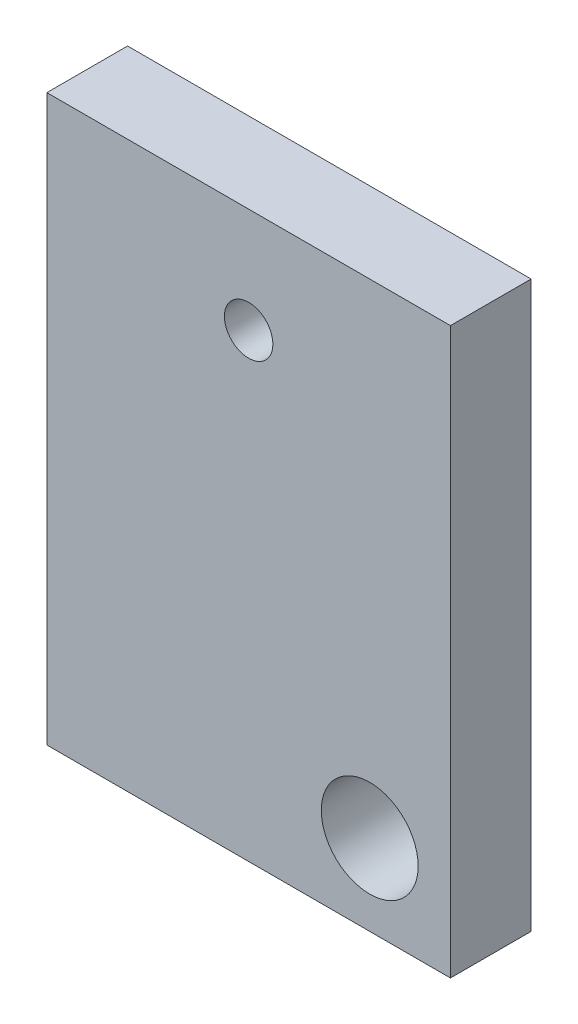
ISO-10303-21;
HEADER;
FILE_DESCRIPTION(('STEP AP214'),'2;1');
FILE_NAME('part.step','',(''),(''),'','','');
FILE_SCHEMA(('AUTOMOTIVE_DESIGN { 1 0 10303 214 1 1 1 1 }'));
ENDSEC;
DATA;
#1=APPLICATION_CONTEXT('core data for automotive mechanical design processes');
#2=APPLICATION_PROTOCOL_DEFINITION('international standard','automotive_design',2000,#1);
#3=PRODUCT_CONTEXT('',#1,'mechanical');
#4=PRODUCT('Part','Part','',(#3));
#5=PRODUCT_RELATED_PRODUCT_CATEGORY('part','',(#4));
#6=PRODUCT_DEFINITION_FORMATION('','',#4);
#7=PRODUCT_DEFINITION_CONTEXT('part definition',#1,'design');
#8=PRODUCT_DEFINITION('design','',#6,#7);
#9=PRODUCT_DEFINITION_SHAPE('','',#8);
#10=(LENGTH_UNIT() NAMED_UNIT(*) SI_UNIT(.MILLI.,.METRE.));
#11=(NAMED_UNIT(*) PLANE_ANGLE_UNIT() SI_UNIT($,.RADIAN.));
#12=(NAMED_UNIT(*) SI_UNIT($,.STERADIAN.) SOLID_ANGLE_UNIT());
#13=UNCERTAINTY_MEASURE_WITH_UNIT(LENGTH_MEASURE(1.E-05),#10,'distance_accuracy_value','');
#14=(GEOMETRIC_REPRESENTATION_CONTEXT(3) GLOBAL_UNCERTAINTY_ASSIGNED_CONTEXT((#13)) GLOBAL_UNIT_ASSIGNED_CONTEXT((#10,
#11,#12)) REPRESENTATION_CONTEXT('',''));
#15=CARTESIAN_POINT('',(0.,0.,0.));
#16=DIRECTION('',(0.,0.,1.));
#17=DIRECTION('',(1.,0.,0.));
#18=AXIS2_PLACEMENT_3D('',#15,#16,#17);
#19=CARTESIAN_POINT('',(12.5,-17.5,5.));
#20=DIRECTION('',(-1.,0.,0.));
#21=DIRECTION('',(0.,0.,1.));
#22=AXIS2_PLACEMENT_3D('',#19,#20,#21);
#23=PLANE('',#22);
#24=DIRECTION('',(0.,1.,0.));
#25=VECTOR('',#24,1.);
#26=CARTESIAN_POINT('',(12.5,-17.5,0.));
#27=LINE('',#26,#25);
#28=CARTESIAN_POINT('',(12.5,-17.5,0.));
#29=VERTEX_POINT('',#28);
#30=CARTESIAN_POINT('',(12.5,17.5,0.));
#31=VERTEX_POINT('',#30);
#32=EDGE_CURVE('E106',#29,#31,#27,.T.);
#33=ORIENTED_EDGE('',*,*,#32,.T.);
#34=DIRECTION('',(0.,0.,-1.));
#35=VECTOR('',#34,1.);
#36=CARTESIAN_POINT('',(12.5,17.5,5.));
#37=LINE('',#36,#35);
#38=CARTESIAN_POINT('',(12.5,17.5,5.));
#39=VERTEX_POINT('',#38);
#40=EDGE_CURVE('E11',#39,#31,#37,.T.);
#41=ORIENTED_EDGE('',*,*,#40,.F.);
#42=DIRECTION('',(0.,1.,0.));
#43=VECTOR('',#42,1.);
#44=CARTESIAN_POINT('',(12.5,-17.5,5.));
#45=LINE('',#44,#43);
#46=CARTESIAN_POINT('',(12.5,-17.5,5.));
#47=VERTEX_POINT('',#46);
#48=EDGE_CURVE('E90',#47,#39,#45,.T.);
#49=ORIENTED_EDGE('',*,*,#48,.F.);
#50=DIRECTION('',(0.,0.,-1.));
#51=VECTOR('',#50,1.);
#52=CARTESIAN_POINT('',(12.5,-17.5,5.));
#53=LINE('',#52,#51);
#54=EDGE_CURVE('E102',#47,#29,#53,.T.);
#55=ORIENTED_EDGE('',*,*,#54,.T.);
#56=EDGE_LOOP('',(#33,#41,#49,#55));
#57=FACE_BOUND('',#56,.T.);
#58=ADVANCED_FACE('F38',(#57),#23,.F.);
#59=CARTESIAN_POINT('',(-12.5,17.5,5.));
#60=DIRECTION('',(0.,-1.,0.));
#61=DIRECTION('',(0.,0.,-1.));
#62=AXIS2_PLACEMENT_3D('',#59,#60,#61);
#63=PLANE('',#62);
#64=DIRECTION('',(-1.,0.,0.));
#65=VECTOR('',#64,1.);
#66=CARTESIAN_POINT('',(-12.5,17.5,0.));
#67=LINE('',#66,#65);
#68=CARTESIAN_POINT('',(-12.5,17.5,0.));
#69=VERTEX_POINT('',#68);
#70=EDGE_CURVE('E95',#31,#69,#67,.T.);
#71=ORIENTED_EDGE('',*,*,#70,.T.);
#72=DIRECTION('',(0.,0.,-1.));
#73=VECTOR('',#72,1.);
#74=CARTESIAN_POINT('',(-12.5,17.5,5.));
#75=LINE('',#74,#73);
#76=CARTESIAN_POINT('',(-12.5,17.5,5.));
#77=VERTEX_POINT('',#76);
#78=EDGE_CURVE('E47',#77,#69,#75,.T.);
#79=ORIENTED_EDGE('',*,*,#78,.F.);
#80=DIRECTION('',(-1.,0.,0.));
#81=VECTOR('',#80,1.);
#82=CARTESIAN_POINT('',(-12.5,17.5,5.));
#83=LINE('',#82,#81);
#84=EDGE_CURVE('E85',#39,#77,#83,.T.);
#85=ORIENTED_EDGE('',*,*,#84,.F.);
#86=ORIENTED_EDGE('',*,*,#40,.T.);
#87=EDGE_LOOP('',(#71,#79,#85,#86));
#88=FACE_BOUND('',#87,.T.);
#89=ADVANCED_FACE('F94',(#88),#63,.F.);
#90=CARTESIAN_POINT('',(-12.5,-17.5,5.));
#91=DIRECTION('',(1.,0.,0.));
#92=DIRECTION('',(0.,0.,-1.));
#93=AXIS2_PLACEMENT_3D('',#90,#91,#92);
#94=PLANE('',#93);
#95=DIRECTION('',(0.,-1.,0.));
#96=VECTOR('',#95,1.);
#97=CARTESIAN_POINT('',(-12.5,-17.5,0.));
#98=LINE('',#97,#96);
#99=CARTESIAN_POINT('',(-12.5,-17.5,0.));
#100=VERTEX_POINT('',#99);
#101=EDGE_CURVE('E72',#69,#100,#98,.T.);
#102=ORIENTED_EDGE('',*,*,#101,.T.);
#103=DIRECTION('',(0.,0.,-1.));
#104=VECTOR('',#103,1.);
#105=CARTESIAN_POINT('',(-12.5,-17.5,5.));
#106=LINE('',#105,#104);
#107=CARTESIAN_POINT('',(-12.5,-17.5,5.));
#108=VERTEX_POINT('',#107);
#109=EDGE_CURVE('E97',#108,#100,#106,.T.);
#110=ORIENTED_EDGE('',*,*,#109,.F.);
#111=DIRECTION('',(0.,-1.,0.));
#112=VECTOR('',#111,1.);
#113=CARTESIAN_POINT('',(-12.5,-17.5,5.));
#114=LINE('',#113,#112);
#115=EDGE_CURVE('E88',#77,#108,#114,.T.);
#116=ORIENTED_EDGE('',*,*,#115,.F.);
#117=ORIENTED_EDGE('',*,*,#78,.T.);
#118=EDGE_LOOP('',(#102,#110,#116,#117));
#119=FACE_BOUND('',#118,.T.);
#120=ADVANCED_FACE('F98',(#119),#94,.F.);
#121=CARTESIAN_POINT('',(-12.5,-17.5,5.));
#122=DIRECTION('',(0.,1.,0.));
#123=DIRECTION('',(0.,0.,1.));
#124=AXIS2_PLACEMENT_3D('',#121,#122,#123);
#125=PLANE('',#124);
#126=DIRECTION('',(1.,0.,0.));
#127=VECTOR('',#126,1.);
#128=CARTESIAN_POINT('',(-12.5,-17.5,0.));
#129=LINE('',#128,#127);
#130=EDGE_CURVE('E78',#100,#29,#129,.T.);
#131=ORIENTED_EDGE('',*,*,#130,.T.);
#132=ORIENTED_EDGE('',*,*,#54,.F.);
#133=DIRECTION('',(1.,0.,0.));
#134=VECTOR('',#133,1.);
#135=CARTESIAN_POINT('',(-12.5,-17.5,5.));
#136=LINE('',#135,#134);
#137=EDGE_CURVE('E55',#108,#47,#136,.T.);
#138=ORIENTED_EDGE('',*,*,#137,.F.);
#139=ORIENTED_EDGE('',*,*,#109,.T.);
#140=EDGE_LOOP('',(#131,#132,#138,#139));
#141=FACE_BOUND('',#140,.T.);
#142=ADVANCED_FACE('F120',(#141),#125,.F.);
#143=CARTESIAN_POINT('',(0.,0.,5.));
#144=DIRECTION('',(0.,0.,-1.));
#145=DIRECTION('',(-1.,0.,0.));
#146=AXIS2_PLACEMENT_3D('',#143,#144,#145);
#147=PLANE('',#146);
#148=CARTESIAN_POINT('',(7.5,-12.5,5.));
#149=DIRECTION('',(0.,0.,1.));
#150=DIRECTION('',(1.,0.,0.));
#151=AXIS2_PLACEMENT_3D('',#148,#149,#150);
#152=CIRCLE('',#151,3.);
#153=CARTESIAN_POINT('',(10.5,-12.5,5.));
#154=VERTEX_POINT('',#153);
#155=EDGE_CURVE('E135',#154,#154,#152,.T.);
#156=ORIENTED_EDGE('',*,*,#155,.F.);
#157=EDGE_LOOP('',(#156));
#158=FACE_BOUND('',#157,.T.);
#159=CARTESIAN_POINT('',(0.,11.,5.));
#160=DIRECTION('',(0.,0.,1.));
#161=DIRECTION('',(1.,0.,0.));
#162=AXIS2_PLACEMENT_3D('',#159,#160,#161);
#163=CIRCLE('',#162,1.5);
#164=CARTESIAN_POINT('',(1.5,11.,5.));
#165=VERTEX_POINT('',#164);
#166=EDGE_CURVE('E127',#165,#165,#163,.T.);
#167=ORIENTED_EDGE('',*,*,#166,.F.);
#168=EDGE_LOOP('',(#167));
#169=FACE_BOUND('',#168,.T.);
#170=ORIENTED_EDGE('',*,*,#48,.T.);
#171=ORIENTED_EDGE('',*,*,#84,.T.);
#172=ORIENTED_EDGE('',*,*,#115,.T.);
#173=ORIENTED_EDGE('',*,*,#137,.T.);
#174=EDGE_LOOP('',(#170,#171,#172,#173));
#175=FACE_BOUND('',#174,.T.);
#176=ADVANCED_FACE('F86',(#158,#169,#175),#147,.F.);
#177=CARTESIAN_POINT('',(0.,0.,0.));
#178=DIRECTION('',(0.,0.,-1.));
#179=DIRECTION('',(-1.,0.,0.));
#180=AXIS2_PLACEMENT_3D('',#177,#178,#179);
#181=PLANE('',#180);
#182=CARTESIAN_POINT('',(7.5,-12.5,0.));
#183=DIRECTION('',(0.,0.,1.));
#184=DIRECTION('',(1.,0.,0.));
#185=AXIS2_PLACEMENT_3D('',#182,#183,#184);
#186=CIRCLE('',#185,3.);
#187=CARTESIAN_POINT('',(10.5,-12.5,0.));
#188=VERTEX_POINT('',#187);
#189=EDGE_CURVE('E131',#188,#188,#186,.T.);
#190=ORIENTED_EDGE('',*,*,#189,.T.);
#191=EDGE_LOOP('',(#190));
#192=FACE_BOUND('',#191,.T.);
#193=CARTESIAN_POINT('',(0.,11.,0.));
#194=DIRECTION('',(0.,0.,1.));
#195=DIRECTION('',(1.,0.,0.));
#196=AXIS2_PLACEMENT_3D('',#193,#194,#195);
#197=CIRCLE('',#196,1.5);
#198=CARTESIAN_POINT('',(1.5,11.,0.));
#199=VERTEX_POINT('',#198);
#200=EDGE_CURVE('E110',#199,#199,#197,.T.);
#201=ORIENTED_EDGE('',*,*,#200,.T.);
#202=EDGE_LOOP('',(#201));
#203=FACE_BOUND('',#202,.T.);
#204=ORIENTED_EDGE('',*,*,#32,.F.);
#205=ORIENTED_EDGE('',*,*,#130,.F.);
#206=ORIENTED_EDGE('',*,*,#101,.F.);
#207=ORIENTED_EDGE('',*,*,#70,.F.);
#208=EDGE_LOOP('',(#204,#205,#206,#207));
#209=FACE_BOUND('',#208,.T.);
#210=ADVANCED_FACE('F123',(#192,#203,#209),#181,.T.);
#211=CARTESIAN_POINT('',(0.,11.,0.));
#212=DIRECTION('',(0.,0.,1.));
#213=DIRECTION('',(1.,0.,0.));
#214=AXIS2_PLACEMENT_3D('',#211,#212,#213);
#215=CYLINDRICAL_SURFACE('',#214,1.5);
#216=ORIENTED_EDGE('',*,*,#200,.F.);
#217=EDGE_LOOP('',(#216));
#218=FACE_BOUND('',#217,.T.);
#219=ORIENTED_EDGE('',*,*,#166,.T.);
#220=EDGE_LOOP('',(#219));
#221=FACE_BOUND('',#220,.T.);
#222=ADVANCED_FACE('F148',(#218,#221),#215,.F.);
#223=CARTESIAN_POINT('',(7.5,-12.5,0.));
#224=DIRECTION('',(0.,0.,1.));
#225=DIRECTION('',(1.,0.,0.));
#226=AXIS2_PLACEMENT_3D('',#223,#224,#225);
#227=CYLINDRICAL_SURFACE('',#226,3.);
#228=ORIENTED_EDGE('',*,*,#189,.F.);
#229=EDGE_LOOP('',(#228));
#230=FACE_BOUND('',#229,.T.);
#231=ORIENTED_EDGE('',*,*,#155,.T.);
#232=EDGE_LOOP('',(#231));
#233=FACE_BOUND('',#232,.T.);
#234=ADVANCED_FACE('F145',(#230,#233),#227,.F.);
#235=CLOSED_SHELL('',(#58,#89,#120,#142,#176,#210,#222,#234));
#236=MANIFOLD_SOLID_BREP('B2',#235);
#237=ADVANCED_BREP_SHAPE_REPRESENTATION('',(#18,#236),#14);
#238=SHAPE_DEFINITION_REPRESENTATION(#9,#237);
ENDSEC;
END-ISO-10303-21;
